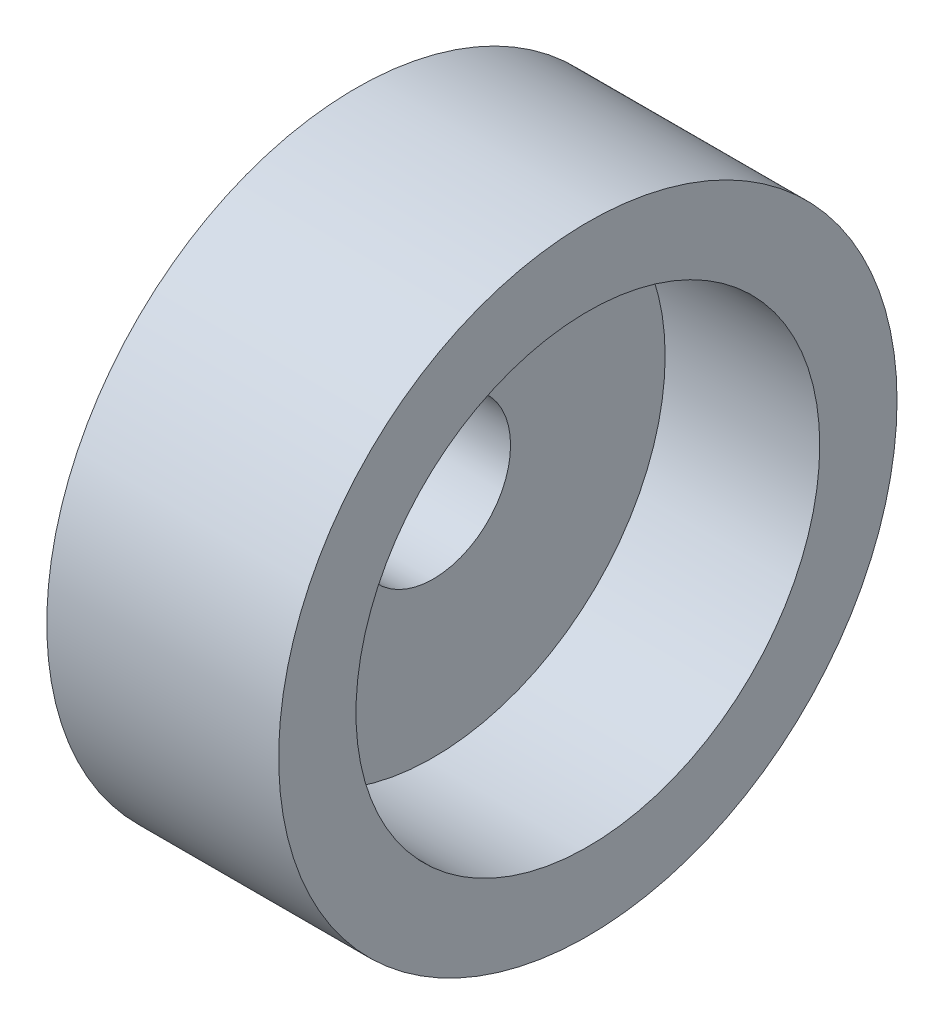
ISO-10303-21;
HEADER;
FILE_DESCRIPTION(('STEP AP214'),'2;1');
FILE_NAME('part.step','',(''),(''),'','','');
FILE_SCHEMA(('AUTOMOTIVE_DESIGN { 1 0 10303 214 1 1 1 1 }'));
ENDSEC;
DATA;
#1=APPLICATION_CONTEXT('core data for automotive mechanical design processes');
#2=APPLICATION_PROTOCOL_DEFINITION('international standard','automotive_design',2000,#1);
#3=PRODUCT_CONTEXT('',#1,'mechanical');
#4=PRODUCT('Part','Part','',(#3));
#5=PRODUCT_RELATED_PRODUCT_CATEGORY('part','',(#4));
#6=PRODUCT_DEFINITION_FORMATION('','',#4);
#7=PRODUCT_DEFINITION_CONTEXT('part definition',#1,'design');
#8=PRODUCT_DEFINITION('design','',#6,#7);
#9=PRODUCT_DEFINITION_SHAPE('','',#8);
#10=(LENGTH_UNIT() NAMED_UNIT(*) SI_UNIT(.MILLI.,.METRE.));
#11=(NAMED_UNIT(*) PLANE_ANGLE_UNIT() SI_UNIT($,.RADIAN.));
#12=(NAMED_UNIT(*) SI_UNIT($,.STERADIAN.) SOLID_ANGLE_UNIT());
#13=UNCERTAINTY_MEASURE_WITH_UNIT(LENGTH_MEASURE(1.E-05),#10,'distance_accuracy_value','');
#14=(GEOMETRIC_REPRESENTATION_CONTEXT(3) GLOBAL_UNCERTAINTY_ASSIGNED_CONTEXT((#13)) GLOBAL_UNIT_ASSIGNED_CONTEXT((#10,
#11,#12)) REPRESENTATION_CONTEXT('',''));
#15=CARTESIAN_POINT('',(0.,0.,0.));
#16=DIRECTION('',(0.,0.,1.));
#17=DIRECTION('',(1.,0.,0.));
#18=AXIS2_PLACEMENT_3D('',#15,#16,#17);
#19=CARTESIAN_POINT('',(3.,0.,0.));
#20=DIRECTION('',(-1.,0.,0.));
#21=DIRECTION('',(0.,0.,1.));
#22=AXIS2_PLACEMENT_3D('',#19,#20,#21);
#23=CYLINDRICAL_SURFACE('',#22,4.);
#24=CARTESIAN_POINT('',(3.,0.,0.));
#25=DIRECTION('',(1.,0.,0.));
#26=DIRECTION('',(0.,0.,-1.));
#27=AXIS2_PLACEMENT_3D('',#24,#25,#26);
#28=CIRCLE('',#27,4.);
#29=CARTESIAN_POINT('',(3.,0.,-4.));
#30=VERTEX_POINT('',#29);
#31=EDGE_CURVE('E44',#30,#30,#28,.T.);
#32=ORIENTED_EDGE('',*,*,#31,.F.);
#33=EDGE_LOOP('',(#32));
#34=FACE_BOUND('',#33,.T.);
#35=CARTESIAN_POINT('',(0.,0.,0.));
#36=DIRECTION('',(1.,0.,0.));
#37=DIRECTION('',(0.,0.,-1.));
#38=AXIS2_PLACEMENT_3D('',#35,#36,#37);
#39=CIRCLE('',#38,4.);
#40=CARTESIAN_POINT('',(0.,0.,-4.));
#41=VERTEX_POINT('',#40);
#42=EDGE_CURVE('E40',#41,#41,#39,.T.);
#43=ORIENTED_EDGE('',*,*,#42,.T.);
#44=EDGE_LOOP('',(#43));
#45=FACE_BOUND('',#44,.T.);
#46=ADVANCED_FACE('F37',(#34,#45),#23,.T.);
#47=CARTESIAN_POINT('',(3.,0.,0.));
#48=DIRECTION('',(1.,0.,0.));
#49=DIRECTION('',(0.,0.,-1.));
#50=AXIS2_PLACEMENT_3D('',#47,#48,#49);
#51=PLANE('',#50);
#52=CARTESIAN_POINT('',(3.,0.,0.));
#53=DIRECTION('',(1.,0.,0.));
#54=DIRECTION('',(0.,0.,-1.));
#55=AXIS2_PLACEMENT_3D('',#52,#53,#54);
#56=CIRCLE('',#55,3.);
#57=CARTESIAN_POINT('',(3.,0.,-3.));
#58=VERTEX_POINT('',#57);
#59=EDGE_CURVE('E56',#58,#58,#56,.T.);
#60=ORIENTED_EDGE('',*,*,#59,.F.);
#61=EDGE_LOOP('',(#60));
#62=FACE_BOUND('',#61,.T.);
#63=ORIENTED_EDGE('',*,*,#31,.T.);
#64=EDGE_LOOP('',(#63));
#65=FACE_BOUND('',#64,.T.);
#66=ADVANCED_FACE('F88',(#62,#65),#51,.T.);
#67=CARTESIAN_POINT('',(0.,0.,0.));
#68=DIRECTION('',(1.,0.,0.));
#69=DIRECTION('',(0.,0.,-1.));
#70=AXIS2_PLACEMENT_3D('',#67,#68,#69);
#71=PLANE('',#70);
#72=CARTESIAN_POINT('',(0.,0.,0.));
#73=DIRECTION('',(-1.,0.,0.));
#74=DIRECTION('',(0.,0.,1.));
#75=AXIS2_PLACEMENT_3D('',#72,#73,#74);
#76=CIRCLE('',#75,2.5);
#77=CARTESIAN_POINT('',(0.,0.,2.5));
#78=VERTEX_POINT('',#77);
#79=EDGE_CURVE('E10',#78,#78,#76,.T.);
#80=ORIENTED_EDGE('',*,*,#79,.F.);
#81=EDGE_LOOP('',(#80));
#82=FACE_BOUND('',#81,.T.);
#83=ORIENTED_EDGE('',*,*,#42,.F.);
#84=EDGE_LOOP('',(#83));
#85=FACE_BOUND('',#84,.T.);
#86=ADVANCED_FACE('F93',(#82,#85),#71,.F.);
#87=CARTESIAN_POINT('',(1.,0.,0.));
#88=DIRECTION('',(1.,0.,0.));
#89=DIRECTION('',(0.,0.,-1.));
#90=AXIS2_PLACEMENT_3D('',#87,#88,#89);
#91=CYLINDRICAL_SURFACE('',#90,3.);
#92=CARTESIAN_POINT('',(1.,0.,0.));
#93=DIRECTION('',(1.,0.,0.));
#94=DIRECTION('',(0.,0.,-1.));
#95=AXIS2_PLACEMENT_3D('',#92,#93,#94);
#96=CIRCLE('',#95,3.);
#97=CARTESIAN_POINT('',(1.,0.,-3.));
#98=VERTEX_POINT('',#97);
#99=EDGE_CURVE('E53',#98,#98,#96,.T.);
#100=ORIENTED_EDGE('',*,*,#99,.F.);
#101=EDGE_LOOP('',(#100));
#102=FACE_BOUND('',#101,.T.);
#103=ORIENTED_EDGE('',*,*,#59,.T.);
#104=EDGE_LOOP('',(#103));
#105=FACE_BOUND('',#104,.T.);
#106=ADVANCED_FACE('F102',(#102,#105),#91,.F.);
#107=CARTESIAN_POINT('',(1.,0.,0.));
#108=DIRECTION('',(1.,0.,0.));
#109=DIRECTION('',(0.,0.,-1.));
#110=AXIS2_PLACEMENT_3D('',#107,#108,#109);
#111=PLANE('',#110);
#112=CARTESIAN_POINT('',(1.,0.,0.));
#113=DIRECTION('',(1.,0.,0.));
#114=DIRECTION('',(0.,0.,-1.));
#115=AXIS2_PLACEMENT_3D('',#112,#113,#114);
#116=CIRCLE('',#115,1.);
#117=CARTESIAN_POINT('',(1.,0.,-1.));
#118=VERTEX_POINT('',#117);
#119=EDGE_CURVE('E61',#118,#118,#116,.T.);
#120=ORIENTED_EDGE('',*,*,#119,.F.);
#121=EDGE_LOOP('',(#120));
#122=FACE_BOUND('',#121,.T.);
#123=ORIENTED_EDGE('',*,*,#99,.T.);
#124=EDGE_LOOP('',(#123));
#125=FACE_BOUND('',#124,.T.);
#126=ADVANCED_FACE('F84',(#122,#125),#111,.T.);
#127=CARTESIAN_POINT('',(-1.,0.,0.));
#128=DIRECTION('',(1.,0.,0.));
#129=DIRECTION('',(0.,0.,-1.));
#130=AXIS2_PLACEMENT_3D('',#127,#128,#129);
#131=CYLINDRICAL_SURFACE('',#130,2.5);
#132=CARTESIAN_POINT('',(-1.,0.,0.));
#133=DIRECTION('',(-1.,0.,0.));
#134=DIRECTION('',(0.,0.,1.));
#135=AXIS2_PLACEMENT_3D('',#132,#133,#134);
#136=CIRCLE('',#135,2.5);
#137=CARTESIAN_POINT('',(-1.,0.,2.5));
#138=VERTEX_POINT('',#137);
#139=EDGE_CURVE('E51',#138,#138,#136,.T.);
#140=ORIENTED_EDGE('',*,*,#139,.F.);
#141=EDGE_LOOP('',(#140));
#142=FACE_BOUND('',#141,.T.);
#143=ORIENTED_EDGE('',*,*,#79,.T.);
#144=EDGE_LOOP('',(#143));
#145=FACE_BOUND('',#144,.T.);
#146=ADVANCED_FACE('F76',(#142,#145),#131,.T.);
#147=CARTESIAN_POINT('',(-1.,0.,0.));
#148=DIRECTION('',(-1.,0.,0.));
#149=DIRECTION('',(0.,0.,1.));
#150=AXIS2_PLACEMENT_3D('',#147,#148,#149);
#151=PLANE('',#150);
#152=CARTESIAN_POINT('',(-1.,0.,0.));
#153=DIRECTION('',(-1.,0.,0.));
#154=DIRECTION('',(0.,0.,1.));
#155=AXIS2_PLACEMENT_3D('',#152,#153,#154);
#156=CIRCLE('',#155,1.);
#157=CARTESIAN_POINT('',(-1.,0.,1.));
#158=VERTEX_POINT('',#157);
#159=EDGE_CURVE('E65',#158,#158,#156,.T.);
#160=ORIENTED_EDGE('',*,*,#159,.F.);
#161=EDGE_LOOP('',(#160));
#162=FACE_BOUND('',#161,.T.);
#163=ORIENTED_EDGE('',*,*,#139,.T.);
#164=EDGE_LOOP('',(#163));
#165=FACE_BOUND('',#164,.T.);
#166=ADVANCED_FACE('F74',(#162,#165),#151,.T.);
#167=CARTESIAN_POINT('',(3.,0.,0.));
#168=DIRECTION('',(-1.,0.,0.));
#169=DIRECTION('',(0.,0.,1.));
#170=AXIS2_PLACEMENT_3D('',#167,#168,#169);
#171=CYLINDRICAL_SURFACE('',#170,1.);
#172=ORIENTED_EDGE('',*,*,#119,.T.);
#173=EDGE_LOOP('',(#172));
#174=FACE_BOUND('',#173,.T.);
#175=ORIENTED_EDGE('',*,*,#159,.T.);
#176=EDGE_LOOP('',(#175));
#177=FACE_BOUND('',#176,.T.);
#178=ADVANCED_FACE('F72',(#174,#177),#171,.F.);
#179=CLOSED_SHELL('',(#46,#66,#86,#106,#126,#146,#166,#178));
#180=MANIFOLD_SOLID_BREP('B2',#179);
#181=ADVANCED_BREP_SHAPE_REPRESENTATION('',(#18,#180),#14);
#182=SHAPE_DEFINITION_REPRESENTATION(#9,#181);
ENDSEC;
END-ISO-10303-21;
